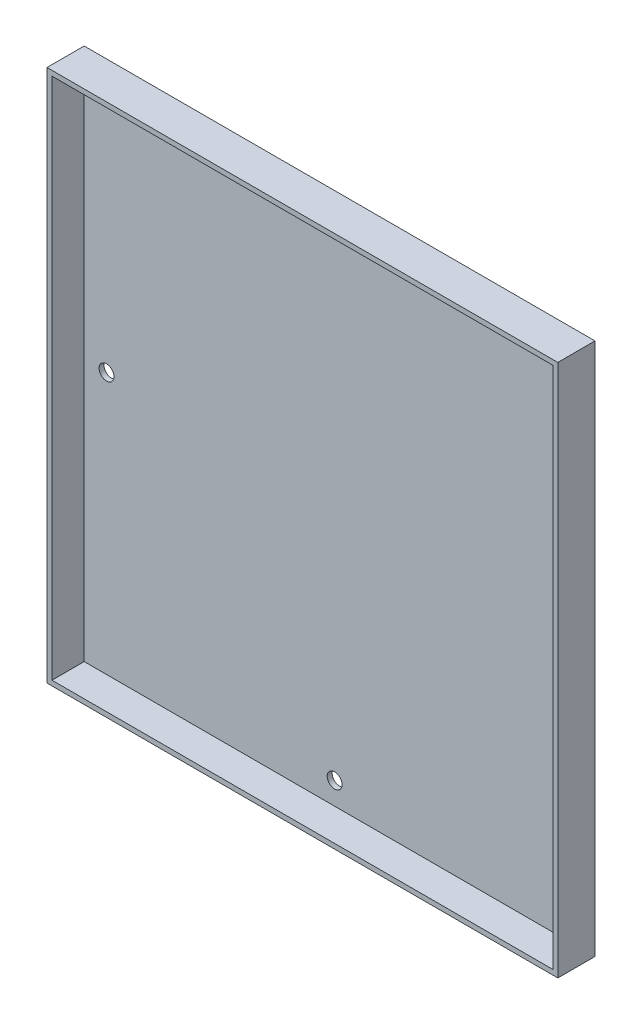
ISO-10303-21;
HEADER;
FILE_DESCRIPTION(('STEP AP214'),'2;1');
FILE_NAME('part.step','',(''),(''),'','','');
FILE_SCHEMA(('AUTOMOTIVE_DESIGN { 1 0 10303 214 1 1 1 1 }'));
ENDSEC;
DATA;
#1=APPLICATION_CONTEXT('core data for automotive mechanical design processes');
#2=APPLICATION_PROTOCOL_DEFINITION('international standard','automotive_design',2000,#1);
#3=PRODUCT_CONTEXT('',#1,'mechanical');
#4=PRODUCT('Part','Part','',(#3));
#5=PRODUCT_RELATED_PRODUCT_CATEGORY('part','',(#4));
#6=PRODUCT_DEFINITION_FORMATION('','',#4);
#7=PRODUCT_DEFINITION_CONTEXT('part definition',#1,'design');
#8=PRODUCT_DEFINITION('design','',#6,#7);
#9=PRODUCT_DEFINITION_SHAPE('','',#8);
#10=(LENGTH_UNIT() NAMED_UNIT(*) SI_UNIT(.MILLI.,.METRE.));
#11=(NAMED_UNIT(*) PLANE_ANGLE_UNIT() SI_UNIT($,.RADIAN.));
#12=(NAMED_UNIT(*) SI_UNIT($,.STERADIAN.) SOLID_ANGLE_UNIT());
#13=UNCERTAINTY_MEASURE_WITH_UNIT(LENGTH_MEASURE(1.E-05),#10,'distance_accuracy_value','');
#14=(GEOMETRIC_REPRESENTATION_CONTEXT(3) GLOBAL_UNCERTAINTY_ASSIGNED_CONTEXT((#13)) GLOBAL_UNIT_ASSIGNED_CONTEXT((#10,
#11,#12)) REPRESENTATION_CONTEXT('',''));
#15=CARTESIAN_POINT('',(0.,0.,0.));
#16=DIRECTION('',(0.,0.,1.));
#17=DIRECTION('',(1.,0.,0.));
#18=AXIS2_PLACEMENT_3D('',#15,#16,#17);
#19=CARTESIAN_POINT('',(0.,0.,15.));
#20=DIRECTION('',(1.,0.,0.));
#21=DIRECTION('',(0.,1.,0.));
#22=AXIS2_PLACEMENT_3D('',#19,#20,#21);
#23=PLANE('',#22);
#24=DIRECTION('',(0.,-1.,0.));
#25=VECTOR('',#24,1.);
#26=CARTESIAN_POINT('',(0.,0.,0.));
#27=LINE('',#26,#25);
#28=CARTESIAN_POINT('',(0.,0.,0.));
#29=VERTEX_POINT('',#28);
#30=CARTESIAN_POINT('',(0.,-215.,0.));
#31=VERTEX_POINT('',#30);
#32=EDGE_CURVE('E146',#29,#31,#27,.T.);
#33=ORIENTED_EDGE('',*,*,#32,.T.);
#34=DIRECTION('',(0.,0.,-1.));
#35=VECTOR('',#34,1.);
#36=CARTESIAN_POINT('',(0.,-215.,15.));
#37=LINE('',#36,#35);
#38=CARTESIAN_POINT('',(0.,-215.,15.));
#39=VERTEX_POINT('',#38);
#40=EDGE_CURVE('E11',#39,#31,#37,.T.);
#41=ORIENTED_EDGE('',*,*,#40,.F.);
#42=DIRECTION('',(0.,-1.,0.));
#43=VECTOR('',#42,1.);
#44=CARTESIAN_POINT('',(0.,0.,15.));
#45=LINE('',#44,#43);
#46=CARTESIAN_POINT('',(0.,0.,15.));
#47=VERTEX_POINT('',#46);
#48=EDGE_CURVE('E139',#47,#39,#45,.T.);
#49=ORIENTED_EDGE('',*,*,#48,.F.);
#50=DIRECTION('',(0.,0.,-1.));
#51=VECTOR('',#50,1.);
#52=CARTESIAN_POINT('',(0.,0.,15.));
#53=LINE('',#52,#51);
#54=EDGE_CURVE('E145',#47,#29,#53,.T.);
#55=ORIENTED_EDGE('',*,*,#54,.T.);
#56=EDGE_LOOP('',(#33,#41,#49,#55));
#57=FACE_BOUND('',#56,.T.);
#58=ADVANCED_FACE('F30',(#57),#23,.F.);
#59=CARTESIAN_POINT('',(0.,-215.,15.));
#60=DIRECTION('',(0.,1.,0.));
#61=DIRECTION('',(0.,0.,1.));
#62=AXIS2_PLACEMENT_3D('',#59,#60,#61);
#63=PLANE('',#62);
#64=DIRECTION('',(1.,0.,0.));
#65=VECTOR('',#64,1.);
#66=CARTESIAN_POINT('',(0.,-215.,0.));
#67=LINE('',#66,#65);
#68=CARTESIAN_POINT('',(206.,-215.,0.));
#69=VERTEX_POINT('',#68);
#70=EDGE_CURVE('E149',#31,#69,#67,.T.);
#71=ORIENTED_EDGE('',*,*,#70,.T.);
#72=DIRECTION('',(0.,0.,-1.));
#73=VECTOR('',#72,1.);
#74=CARTESIAN_POINT('',(206.,-215.,15.));
#75=LINE('',#74,#73);
#76=CARTESIAN_POINT('',(206.,-215.,15.));
#77=VERTEX_POINT('',#76);
#78=EDGE_CURVE('E38',#77,#69,#75,.T.);
#79=ORIENTED_EDGE('',*,*,#78,.F.);
#80=DIRECTION('',(1.,0.,0.));
#81=VECTOR('',#80,1.);
#82=CARTESIAN_POINT('',(0.,-215.,15.));
#83=LINE('',#82,#81);
#84=EDGE_CURVE('E83',#39,#77,#83,.T.);
#85=ORIENTED_EDGE('',*,*,#84,.F.);
#86=ORIENTED_EDGE('',*,*,#40,.T.);
#87=EDGE_LOOP('',(#71,#79,#85,#86));
#88=FACE_BOUND('',#87,.T.);
#89=ADVANCED_FACE('F202',(#88),#63,.F.);
#90=CARTESIAN_POINT('',(206.,0.,15.));
#91=DIRECTION('',(-1.,0.,0.));
#92=DIRECTION('',(0.,-1.,0.));
#93=AXIS2_PLACEMENT_3D('',#90,#91,#92);
#94=PLANE('',#93);
#95=DIRECTION('',(0.,1.,0.));
#96=VECTOR('',#95,1.);
#97=CARTESIAN_POINT('',(206.,0.,0.));
#98=LINE('',#97,#96);
#99=CARTESIAN_POINT('',(206.,0.,0.));
#100=VERTEX_POINT('',#99);
#101=EDGE_CURVE('E151',#69,#100,#98,.T.);
#102=ORIENTED_EDGE('',*,*,#101,.T.);
#103=DIRECTION('',(0.,0.,-1.));
#104=VECTOR('',#103,1.);
#105=CARTESIAN_POINT('',(206.,0.,15.));
#106=LINE('',#105,#104);
#107=CARTESIAN_POINT('',(206.,0.,15.));
#108=VERTEX_POINT('',#107);
#109=EDGE_CURVE('E155',#108,#100,#106,.T.);
#110=ORIENTED_EDGE('',*,*,#109,.F.);
#111=DIRECTION('',(0.,1.,0.));
#112=VECTOR('',#111,1.);
#113=CARTESIAN_POINT('',(206.,0.,15.));
#114=LINE('',#113,#112);
#115=EDGE_CURVE('E142',#77,#108,#114,.T.);
#116=ORIENTED_EDGE('',*,*,#115,.F.);
#117=ORIENTED_EDGE('',*,*,#78,.T.);
#118=EDGE_LOOP('',(#102,#110,#116,#117));
#119=FACE_BOUND('',#118,.T.);
#120=ADVANCED_FACE('F207',(#119),#94,.F.);
#121=CARTESIAN_POINT('',(0.,0.,15.));
#122=DIRECTION('',(0.,-1.,0.));
#123=DIRECTION('',(0.,0.,-1.));
#124=AXIS2_PLACEMENT_3D('',#121,#122,#123);
#125=PLANE('',#124);
#126=DIRECTION('',(-1.,0.,0.));
#127=VECTOR('',#126,1.);
#128=CARTESIAN_POINT('',(0.,0.,0.));
#129=LINE('',#128,#127);
#130=EDGE_CURVE('E76',#100,#29,#129,.T.);
#131=ORIENTED_EDGE('',*,*,#130,.T.);
#132=ORIENTED_EDGE('',*,*,#54,.F.);
#133=DIRECTION('',(-1.,0.,0.));
#134=VECTOR('',#133,1.);
#135=CARTESIAN_POINT('',(0.,0.,15.));
#136=LINE('',#135,#134);
#137=EDGE_CURVE('E55',#108,#47,#136,.T.);
#138=ORIENTED_EDGE('',*,*,#137,.F.);
#139=ORIENTED_EDGE('',*,*,#109,.T.);
#140=EDGE_LOOP('',(#131,#132,#138,#139));
#141=FACE_BOUND('',#140,.T.);
#142=ADVANCED_FACE('F196',(#141),#125,.F.);
#143=CARTESIAN_POINT('',(0.,-215.,15.));
#144=DIRECTION('',(0.,0.,1.));
#145=DIRECTION('',(1.,0.,0.));
#146=AXIS2_PLACEMENT_3D('',#143,#144,#145);
#147=PLANE('',#146);
#148=DIRECTION('',(0.,-1.,0.));
#149=VECTOR('',#148,1.);
#150=CARTESIAN_POINT('',(2.,0.,15.));
#151=LINE('',#150,#149);
#152=CARTESIAN_POINT('',(2.,-2.,15.));
#153=VERTEX_POINT('',#152);
#154=CARTESIAN_POINT('',(2.00000000000003,-213.,15.));
#155=VERTEX_POINT('',#154);
#156=EDGE_CURVE('E128',#153,#155,#151,.T.);
#157=ORIENTED_EDGE('',*,*,#156,.F.);
#158=DIRECTION('',(-1.,0.,0.));
#159=VECTOR('',#158,1.);
#160=CARTESIAN_POINT('',(0.,-2.,15.));
#161=LINE('',#160,#159);
#162=CARTESIAN_POINT('',(204.,-2.,15.));
#163=VERTEX_POINT('',#162);
#164=EDGE_CURVE('E137',#163,#153,#161,.T.);
#165=ORIENTED_EDGE('',*,*,#164,.F.);
#166=DIRECTION('',(0.,1.,0.));
#167=VECTOR('',#166,1.);
#168=CARTESIAN_POINT('',(204.,0.,15.));
#169=LINE('',#168,#167);
#170=CARTESIAN_POINT('',(204.,-213.,15.));
#171=VERTEX_POINT('',#170);
#172=EDGE_CURVE('E135',#171,#163,#169,.T.);
#173=ORIENTED_EDGE('',*,*,#172,.F.);
#174=DIRECTION('',(1.,0.,0.));
#175=VECTOR('',#174,1.);
#176=CARTESIAN_POINT('',(0.,-213.,15.));
#177=LINE('',#176,#175);
#178=EDGE_CURVE('E120',#155,#171,#177,.T.);
#179=ORIENTED_EDGE('',*,*,#178,.F.);
#180=EDGE_LOOP('',(#157,#165,#173,#179));
#181=FACE_BOUND('',#180,.T.);
#182=ORIENTED_EDGE('',*,*,#48,.T.);
#183=ORIENTED_EDGE('',*,*,#84,.T.);
#184=ORIENTED_EDGE('',*,*,#115,.T.);
#185=ORIENTED_EDGE('',*,*,#137,.T.);
#186=EDGE_LOOP('',(#182,#183,#184,#185));
#187=FACE_BOUND('',#186,.T.);
#188=ADVANCED_FACE('F193',(#181,#187),#147,.T.);
#189=CARTESIAN_POINT('',(0.,-215.,0.));
#190=DIRECTION('',(0.,0.,1.));
#191=DIRECTION('',(1.,0.,0.));
#192=AXIS2_PLACEMENT_3D('',#189,#190,#191);
#193=PLANE('',#192);
#194=CARTESIAN_POINT('',(103.,-204.,0.));
#195=DIRECTION('',(0.,0.,-1.));
#196=DIRECTION('',(-1.,0.,0.));
#197=AXIS2_PLACEMENT_3D('',#194,#195,#196);
#198=CIRCLE('',#197,3.00000000000001);
#199=CARTESIAN_POINT('',(100.,-204.,0.));
#200=VERTEX_POINT('',#199);
#201=EDGE_CURVE('E178',#200,#200,#198,.T.);
#202=ORIENTED_EDGE('',*,*,#201,.F.);
#203=EDGE_LOOP('',(#202));
#204=FACE_BOUND('',#203,.T.);
#205=CARTESIAN_POINT('',(11.,-107.5,0.));
#206=DIRECTION('',(0.,0.,-1.));
#207=DIRECTION('',(-1.,0.,0.));
#208=AXIS2_PLACEMENT_3D('',#205,#206,#207);
#209=CIRCLE('',#208,3.);
#210=CARTESIAN_POINT('',(8.,-107.5,0.));
#211=VERTEX_POINT('',#210);
#212=EDGE_CURVE('E168',#211,#211,#209,.T.);
#213=ORIENTED_EDGE('',*,*,#212,.F.);
#214=EDGE_LOOP('',(#213));
#215=FACE_BOUND('',#214,.T.);
#216=CARTESIAN_POINT('',(195.,-107.5,0.));
#217=DIRECTION('',(0.,0.,-1.));
#218=DIRECTION('',(-1.,0.,0.));
#219=AXIS2_PLACEMENT_3D('',#216,#217,#218);
#220=CIRCLE('',#219,2.99999999999999);
#221=CARTESIAN_POINT('',(192.,-107.5,0.));
#222=VERTEX_POINT('',#221);
#223=EDGE_CURVE('E165',#222,#222,#220,.T.);
#224=ORIENTED_EDGE('',*,*,#223,.F.);
#225=EDGE_LOOP('',(#224));
#226=FACE_BOUND('',#225,.T.);
#227=CARTESIAN_POINT('',(103.,-11.,0.));
#228=DIRECTION('',(0.,0.,-1.));
#229=DIRECTION('',(-1.,0.,0.));
#230=AXIS2_PLACEMENT_3D('',#227,#228,#229);
#231=CIRCLE('',#230,3.00000000000001);
#232=CARTESIAN_POINT('',(100.,-11.,0.));
#233=VERTEX_POINT('',#232);
#234=EDGE_CURVE('E162',#233,#233,#231,.T.);
#235=ORIENTED_EDGE('',*,*,#234,.F.);
#236=EDGE_LOOP('',(#235));
#237=FACE_BOUND('',#236,.T.);
#238=ORIENTED_EDGE('',*,*,#32,.F.);
#239=ORIENTED_EDGE('',*,*,#130,.F.);
#240=ORIENTED_EDGE('',*,*,#101,.F.);
#241=ORIENTED_EDGE('',*,*,#70,.F.);
#242=EDGE_LOOP('',(#238,#239,#240,#241));
#243=FACE_BOUND('',#242,.T.);
#244=ADVANCED_FACE('F195',(#204,#215,#226,#237,#243),#193,.F.);
#245=CARTESIAN_POINT('',(2.,0.,15.));
#246=DIRECTION('',(1.,0.,0.));
#247=DIRECTION('',(0.,1.,0.));
#248=AXIS2_PLACEMENT_3D('',#245,#246,#247);
#249=PLANE('',#248);
#250=DIRECTION('',(0.,-1.,0.));
#251=VECTOR('',#250,1.);
#252=CARTESIAN_POINT('',(2.,0.,2.));
#253=LINE('',#252,#251);
#254=CARTESIAN_POINT('',(2.,-2.,2.));
#255=VERTEX_POINT('',#254);
#256=CARTESIAN_POINT('',(2.00000000000003,-213.,2.));
#257=VERTEX_POINT('',#256);
#258=EDGE_CURVE('E111',#255,#257,#253,.T.);
#259=ORIENTED_EDGE('',*,*,#258,.F.);
#260=DIRECTION('',(0.,0.,-1.));
#261=VECTOR('',#260,1.);
#262=CARTESIAN_POINT('',(2.,-2.,15.));
#263=LINE('',#262,#261);
#264=EDGE_CURVE('E131',#153,#255,#263,.T.);
#265=ORIENTED_EDGE('',*,*,#264,.F.);
#266=ORIENTED_EDGE('',*,*,#156,.T.);
#267=DIRECTION('',(0.,0.,-1.));
#268=VECTOR('',#267,1.);
#269=CARTESIAN_POINT('',(2.00000000000003,-213.,15.));
#270=LINE('',#269,#268);
#271=EDGE_CURVE('E123',#155,#257,#270,.T.);
#272=ORIENTED_EDGE('',*,*,#271,.T.);
#273=EDGE_LOOP('',(#259,#265,#266,#272));
#274=FACE_BOUND('',#273,.T.);
#275=ADVANCED_FACE('F191',(#274),#249,.T.);
#276=CARTESIAN_POINT('',(0.,-213.,15.));
#277=DIRECTION('',(0.,1.,0.));
#278=DIRECTION('',(0.,0.,1.));
#279=AXIS2_PLACEMENT_3D('',#276,#277,#278);
#280=PLANE('',#279);
#281=DIRECTION('',(1.,0.,0.));
#282=VECTOR('',#281,1.);
#283=CARTESIAN_POINT('',(0.,-213.,2.));
#284=LINE('',#283,#282);
#285=CARTESIAN_POINT('',(204.,-213.,2.));
#286=VERTEX_POINT('',#285);
#287=EDGE_CURVE('E105',#257,#286,#284,.T.);
#288=ORIENTED_EDGE('',*,*,#287,.F.);
#289=ORIENTED_EDGE('',*,*,#271,.F.);
#290=ORIENTED_EDGE('',*,*,#178,.T.);
#291=DIRECTION('',(0.,0.,-1.));
#292=VECTOR('',#291,1.);
#293=CARTESIAN_POINT('',(204.,-213.,15.));
#294=LINE('',#293,#292);
#295=EDGE_CURVE('E117',#171,#286,#294,.T.);
#296=ORIENTED_EDGE('',*,*,#295,.T.);
#297=EDGE_LOOP('',(#288,#289,#290,#296));
#298=FACE_BOUND('',#297,.T.);
#299=ADVANCED_FACE('F118',(#298),#280,.T.);
#300=CARTESIAN_POINT('',(204.,0.,15.));
#301=DIRECTION('',(-1.,0.,0.));
#302=DIRECTION('',(0.,-1.,0.));
#303=AXIS2_PLACEMENT_3D('',#300,#301,#302);
#304=PLANE('',#303);
#305=DIRECTION('',(0.,1.,0.));
#306=VECTOR('',#305,1.);
#307=CARTESIAN_POINT('',(204.,0.,2.));
#308=LINE('',#307,#306);
#309=CARTESIAN_POINT('',(204.,-2.,2.));
#310=VERTEX_POINT('',#309);
#311=EDGE_CURVE('E109',#286,#310,#308,.T.);
#312=ORIENTED_EDGE('',*,*,#311,.F.);
#313=ORIENTED_EDGE('',*,*,#295,.F.);
#314=ORIENTED_EDGE('',*,*,#172,.T.);
#315=DIRECTION('',(0.,0.,-1.));
#316=VECTOR('',#315,1.);
#317=CARTESIAN_POINT('',(204.,-2.,15.));
#318=LINE('',#317,#316);
#319=EDGE_CURVE('E46',#163,#310,#318,.T.);
#320=ORIENTED_EDGE('',*,*,#319,.T.);
#321=EDGE_LOOP('',(#312,#313,#314,#320));
#322=FACE_BOUND('',#321,.T.);
#323=ADVANCED_FACE('F125',(#322),#304,.T.);
#324=CARTESIAN_POINT('',(0.,-2.,15.));
#325=DIRECTION('',(0.,-1.,0.));
#326=DIRECTION('',(0.,0.,-1.));
#327=AXIS2_PLACEMENT_3D('',#324,#325,#326);
#328=PLANE('',#327);
#329=DIRECTION('',(-1.,0.,0.));
#330=VECTOR('',#329,1.);
#331=CARTESIAN_POINT('',(0.,-2.,2.));
#332=LINE('',#331,#330);
#333=EDGE_CURVE('E126',#310,#255,#332,.T.);
#334=ORIENTED_EDGE('',*,*,#333,.F.);
#335=ORIENTED_EDGE('',*,*,#319,.F.);
#336=ORIENTED_EDGE('',*,*,#164,.T.);
#337=ORIENTED_EDGE('',*,*,#264,.T.);
#338=EDGE_LOOP('',(#334,#335,#336,#337));
#339=FACE_BOUND('',#338,.T.);
#340=ADVANCED_FACE('F187',(#339),#328,.T.);
#341=CARTESIAN_POINT('',(0.,-215.,2.));
#342=DIRECTION('',(0.,0.,1.));
#343=DIRECTION('',(1.,0.,0.));
#344=AXIS2_PLACEMENT_3D('',#341,#342,#343);
#345=PLANE('',#344);
#346=CARTESIAN_POINT('',(103.,-204.,2.));
#347=DIRECTION('',(0.,0.,1.));
#348=DIRECTION('',(1.,0.,0.));
#349=AXIS2_PLACEMENT_3D('',#346,#347,#348);
#350=CIRCLE('',#349,3.00000000000001);
#351=CARTESIAN_POINT('',(106.,-204.,2.));
#352=VERTEX_POINT('',#351);
#353=EDGE_CURVE('E33',#352,#352,#350,.T.);
#354=ORIENTED_EDGE('',*,*,#353,.F.);
#355=EDGE_LOOP('',(#354));
#356=FACE_BOUND('',#355,.T.);
#357=CARTESIAN_POINT('',(11.,-107.5,2.));
#358=DIRECTION('',(0.,0.,1.));
#359=DIRECTION('',(1.,0.,0.));
#360=AXIS2_PLACEMENT_3D('',#357,#358,#359);
#361=CIRCLE('',#360,3.);
#362=CARTESIAN_POINT('',(14.,-107.5,2.));
#363=VERTEX_POINT('',#362);
#364=EDGE_CURVE('E166',#363,#363,#361,.T.);
#365=ORIENTED_EDGE('',*,*,#364,.F.);
#366=EDGE_LOOP('',(#365));
#367=FACE_BOUND('',#366,.T.);
#368=CARTESIAN_POINT('',(195.,-107.5,2.));
#369=DIRECTION('',(0.,0.,1.));
#370=DIRECTION('',(1.,0.,0.));
#371=AXIS2_PLACEMENT_3D('',#368,#369,#370);
#372=CIRCLE('',#371,2.99999999999999);
#373=CARTESIAN_POINT('',(198.,-107.5,2.));
#374=VERTEX_POINT('',#373);
#375=EDGE_CURVE('E163',#374,#374,#372,.T.);
#376=ORIENTED_EDGE('',*,*,#375,.F.);
#377=EDGE_LOOP('',(#376));
#378=FACE_BOUND('',#377,.T.);
#379=CARTESIAN_POINT('',(103.,-11.,2.));
#380=DIRECTION('',(0.,0.,1.));
#381=DIRECTION('',(1.,0.,0.));
#382=AXIS2_PLACEMENT_3D('',#379,#380,#381);
#383=CIRCLE('',#382,3.00000000000001);
#384=CARTESIAN_POINT('',(106.,-11.,2.));
#385=VERTEX_POINT('',#384);
#386=EDGE_CURVE('E159',#385,#385,#383,.T.);
#387=ORIENTED_EDGE('',*,*,#386,.F.);
#388=EDGE_LOOP('',(#387));
#389=FACE_BOUND('',#388,.T.);
#390=ORIENTED_EDGE('',*,*,#258,.T.);
#391=ORIENTED_EDGE('',*,*,#287,.T.);
#392=ORIENTED_EDGE('',*,*,#311,.T.);
#393=ORIENTED_EDGE('',*,*,#333,.T.);
#394=EDGE_LOOP('',(#390,#391,#392,#393));
#395=FACE_BOUND('',#394,.T.);
#396=ADVANCED_FACE('F107',(#356,#367,#378,#389,#395),#345,.T.);
#397=CARTESIAN_POINT('',(103.,-11.,10.));
#398=DIRECTION('',(0.,0.,-1.));
#399=DIRECTION('',(-1.,0.,0.));
#400=AXIS2_PLACEMENT_3D('',#397,#398,#399);
#401=CYLINDRICAL_SURFACE('',#400,3.00000000000001);
#402=ORIENTED_EDGE('',*,*,#386,.T.);
#403=EDGE_LOOP('',(#402));
#404=FACE_BOUND('',#403,.T.);
#405=ORIENTED_EDGE('',*,*,#234,.T.);
#406=EDGE_LOOP('',(#405));
#407=FACE_BOUND('',#406,.T.);
#408=ADVANCED_FACE('F279',(#404,#407),#401,.F.);
#409=CARTESIAN_POINT('',(195.,-107.5,10.));
#410=DIRECTION('',(0.,0.,-1.));
#411=DIRECTION('',(-1.,0.,0.));
#412=AXIS2_PLACEMENT_3D('',#409,#410,#411);
#413=CYLINDRICAL_SURFACE('',#412,2.99999999999999);
#414=ORIENTED_EDGE('',*,*,#375,.T.);
#415=EDGE_LOOP('',(#414));
#416=FACE_BOUND('',#415,.T.);
#417=ORIENTED_EDGE('',*,*,#223,.T.);
#418=EDGE_LOOP('',(#417));
#419=FACE_BOUND('',#418,.T.);
#420=ADVANCED_FACE('F289',(#416,#419),#413,.F.);
#421=CARTESIAN_POINT('',(11.,-107.5,10.));
#422=DIRECTION('',(0.,0.,-1.));
#423=DIRECTION('',(-1.,0.,0.));
#424=AXIS2_PLACEMENT_3D('',#421,#422,#423);
#425=CYLINDRICAL_SURFACE('',#424,3.);
#426=ORIENTED_EDGE('',*,*,#364,.T.);
#427=EDGE_LOOP('',(#426));
#428=FACE_BOUND('',#427,.T.);
#429=ORIENTED_EDGE('',*,*,#212,.T.);
#430=EDGE_LOOP('',(#429));
#431=FACE_BOUND('',#430,.T.);
#432=ADVANCED_FACE('F299',(#428,#431),#425,.F.);
#433=CARTESIAN_POINT('',(103.,-204.,10.));
#434=DIRECTION('',(0.,0.,-1.));
#435=DIRECTION('',(-1.,0.,0.));
#436=AXIS2_PLACEMENT_3D('',#433,#434,#435);
#437=CYLINDRICAL_SURFACE('',#436,3.00000000000001);
#438=ORIENTED_EDGE('',*,*,#353,.T.);
#439=EDGE_LOOP('',(#438));
#440=FACE_BOUND('',#439,.T.);
#441=ORIENTED_EDGE('',*,*,#201,.T.);
#442=EDGE_LOOP('',(#441));
#443=FACE_BOUND('',#442,.T.);
#444=ADVANCED_FACE('F309',(#440,#443),#437,.F.);
#445=CLOSED_SHELL('',(#58,#89,#120,#142,#188,#244,#275,#299,#323,#340,#396,#408,#420,#432,#444));
#446=MANIFOLD_SOLID_BREP('B2',#445);
#447=ADVANCED_BREP_SHAPE_REPRESENTATION('',(#18,#446),#14);
#448=SHAPE_DEFINITION_REPRESENTATION(#9,#447);
ENDSEC;
END-ISO-10303-21;
